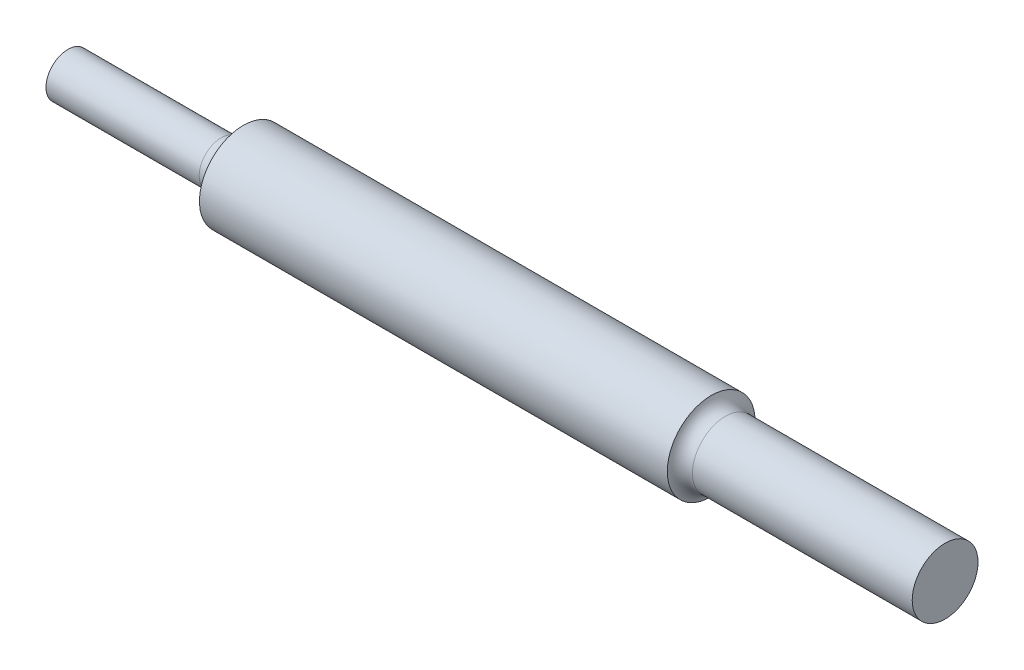
ISO-10303-21;
HEADER;
FILE_DESCRIPTION(('STEP AP214'),'2;1');
FILE_NAME('part.step','',(''),(''),'','','');
FILE_SCHEMA(('AUTOMOTIVE_DESIGN { 1 0 10303 214 1 1 1 1 }'));
ENDSEC;
DATA;
#1=APPLICATION_CONTEXT('core data for automotive mechanical design processes');
#2=APPLICATION_PROTOCOL_DEFINITION('international standard','automotive_design',2000,#1);
#3=PRODUCT_CONTEXT('',#1,'mechanical');
#4=PRODUCT('Part','Part','',(#3));
#5=PRODUCT_RELATED_PRODUCT_CATEGORY('part','',(#4));
#6=PRODUCT_DEFINITION_FORMATION('','',#4);
#7=PRODUCT_DEFINITION_CONTEXT('part definition',#1,'design');
#8=PRODUCT_DEFINITION('design','',#6,#7);
#9=PRODUCT_DEFINITION_SHAPE('','',#8);
#10=(LENGTH_UNIT() NAMED_UNIT(*) SI_UNIT(.MILLI.,.METRE.));
#11=(NAMED_UNIT(*) PLANE_ANGLE_UNIT() SI_UNIT($,.RADIAN.));
#12=(NAMED_UNIT(*) SI_UNIT($,.STERADIAN.) SOLID_ANGLE_UNIT());
#13=UNCERTAINTY_MEASURE_WITH_UNIT(LENGTH_MEASURE(1.E-05),#10,'distance_accuracy_value','');
#14=(GEOMETRIC_REPRESENTATION_CONTEXT(3) GLOBAL_UNCERTAINTY_ASSIGNED_CONTEXT((#13)) GLOBAL_UNIT_ASSIGNED_CONTEXT((#10,
#11,#12)) REPRESENTATION_CONTEXT('',''));
#15=CARTESIAN_POINT('',(0.,0.,0.));
#16=DIRECTION('',(0.,0.,1.));
#17=DIRECTION('',(1.,0.,0.));
#18=AXIS2_PLACEMENT_3D('',#15,#16,#17);
#19=CARTESIAN_POINT('',(203.2,0.,0.));
#20=DIRECTION('',(-1.,0.,0.));
#21=DIRECTION('',(0.,0.,1.));
#22=AXIS2_PLACEMENT_3D('',#19,#20,#21);
#23=CYLINDRICAL_SURFACE('',#22,19.05);
#24=CARTESIAN_POINT('',(203.2,0.,0.));
#25=DIRECTION('',(1.,0.,0.));
#26=DIRECTION('',(0.,0.,-1.));
#27=AXIS2_PLACEMENT_3D('',#24,#25,#26);
#28=CIRCLE('',#27,19.05);
#29=CARTESIAN_POINT('',(203.2,0.,-19.05));
#30=VERTEX_POINT('',#29);
#31=EDGE_CURVE('E50',#30,#30,#28,.T.);
#32=ORIENTED_EDGE('',*,*,#31,.F.);
#33=EDGE_LOOP('',(#32));
#34=FACE_BOUND('',#33,.T.);
#35=CARTESIAN_POINT('',(0.,0.,0.));
#36=DIRECTION('',(1.,0.,0.));
#37=DIRECTION('',(0.,0.,-1.));
#38=AXIS2_PLACEMENT_3D('',#35,#36,#37);
#39=CIRCLE('',#38,19.05);
#40=CARTESIAN_POINT('',(0.,0.,-19.05));
#41=VERTEX_POINT('',#40);
#42=EDGE_CURVE('E55',#41,#41,#39,.T.);
#43=ORIENTED_EDGE('',*,*,#42,.T.);
#44=EDGE_LOOP('',(#43));
#45=FACE_BOUND('',#44,.T.);
#46=ADVANCED_FACE('F37',(#34,#45),#23,.T.);
#47=CARTESIAN_POINT('',(304.8,0.,0.));
#48=DIRECTION('',(-1.,0.,0.));
#49=DIRECTION('',(0.,0.,1.));
#50=AXIS2_PLACEMENT_3D('',#47,#48,#49);
#51=CYLINDRICAL_SURFACE('',#50,14.2875);
#52=CARTESIAN_POINT('',(209.348361062104,0.,0.));
#53=DIRECTION('',(-1.,0.,0.));
#54=DIRECTION('',(0.,0.,1.));
#55=AXIS2_PLACEMENT_3D('',#52,#53,#54);
#56=CIRCLE('',#55,14.2875);
#57=CARTESIAN_POINT('',(209.348361062104,0.,14.2875));
#58=VERTEX_POINT('',#57);
#59=EDGE_CURVE('E10',#58,#58,#56,.F.);
#60=ORIENTED_EDGE('',*,*,#59,.T.);
#61=EDGE_LOOP('',(#60));
#62=FACE_BOUND('',#61,.T.);
#63=CARTESIAN_POINT('',(304.8,0.,0.));
#64=DIRECTION('',(1.,0.,0.));
#65=DIRECTION('',(0.,0.,-1.));
#66=AXIS2_PLACEMENT_3D('',#63,#64,#65);
#67=CIRCLE('',#66,14.2875);
#68=CARTESIAN_POINT('',(304.8,0.,-14.2875));
#69=VERTEX_POINT('',#68);
#70=EDGE_CURVE('E60',#69,#69,#67,.T.);
#71=ORIENTED_EDGE('',*,*,#70,.F.);
#72=EDGE_LOOP('',(#71));
#73=FACE_BOUND('',#72,.T.);
#74=ADVANCED_FACE('F82',(#62,#73),#51,.T.);
#75=CARTESIAN_POINT('',(304.8,0.,0.));
#76=DIRECTION('',(1.,0.,0.));
#77=DIRECTION('',(0.,0.,-1.));
#78=AXIS2_PLACEMENT_3D('',#75,#76,#77);
#79=PLANE('',#78);
#80=ORIENTED_EDGE('',*,*,#70,.T.);
#81=EDGE_LOOP('',(#80));
#82=FACE_BOUND('',#81,.T.);
#83=ADVANCED_FACE('F74',(#82),#79,.T.);
#84=CARTESIAN_POINT('',(-76.2,0.,0.));
#85=DIRECTION('',(1.,0.,0.));
#86=DIRECTION('',(0.,0.,-1.));
#87=AXIS2_PLACEMENT_3D('',#84,#85,#86);
#88=CYLINDRICAL_SURFACE('',#87,9.525);
#89=CARTESIAN_POINT('',(-9.65116443751739,0.,0.));
#90=DIRECTION('',(1.,0.,0.));
#91=DIRECTION('',(0.,0.,-1.));
#92=AXIS2_PLACEMENT_3D('',#89,#90,#91);
#93=CIRCLE('',#92,9.525);
#94=CARTESIAN_POINT('',(-9.6511644375174,0.,-9.525));
#95=VERTEX_POINT('',#94);
#96=EDGE_CURVE('E45',#95,#95,#93,.F.);
#97=CARTESIAN_POINT('',(-76.2,0.,0.));
#98=DIRECTION('',(-1.,0.,0.));
#99=DIRECTION('',(0.,0.,1.));
#100=AXIS2_PLACEMENT_3D('',#97,#98,#99);
#101=CIRCLE('',#100,9.525);
#102=CARTESIAN_POINT('',(-76.2,0.,-9.525));
#103=VERTEX_POINT('',#102);
#104=EDGE_CURVE('E65',#103,#103,#101,.T.);
#105=CARTESIAN_POINT('',(-9.6511644375174,0.,-9.525));
#106=CARTESIAN_POINT('',(-10.3443814746266,0.,-9.525));
#107=CARTESIAN_POINT('',(-11.0375985117358,0.,-9.525));
#108=CARTESIAN_POINT('',(-12.4240325859542,0.,-9.525));
#109=CARTESIAN_POINT('',(-13.1172496230634,0.,-9.525));
#110=CARTESIAN_POINT('',(-14.5036836972817,0.,-9.525));
#111=CARTESIAN_POINT('',(-15.1969007343909,0.,-9.525));
#112=CARTESIAN_POINT('',(-16.5833348086093,0.,-9.525));
#113=CARTESIAN_POINT('',(-17.2765518457185,0.,-9.525));
#114=CARTESIAN_POINT('',(-18.6629859199369,0.,-9.525));
#115=CARTESIAN_POINT('',(-19.3562029570461,0.,-9.525));
#116=CARTESIAN_POINT('',(-20.7426370312645,0.,-9.525));
#117=CARTESIAN_POINT('',(-21.4358540683737,0.,-9.525));
#118=CARTESIAN_POINT('',(-22.8222881425921,0.,-9.525));
#119=CARTESIAN_POINT('',(-23.5155051797013,0.,-9.525));
#120=CARTESIAN_POINT('',(-24.9019392539197,0.,-9.525));
#121=CARTESIAN_POINT('',(-25.5951562910289,0.,-9.525));
#122=CARTESIAN_POINT('',(-26.9815903652472,0.,-9.525));
#123=CARTESIAN_POINT('',(-27.6748074023564,0.,-9.525));
#124=CARTESIAN_POINT('',(-29.0612414765748,0.,-9.525));
#125=CARTESIAN_POINT('',(-29.754458513684,0.,-9.525));
#126=CARTESIAN_POINT('',(-31.1408925879024,0.,-9.525));
#127=CARTESIAN_POINT('',(-31.8341096250116,0.,-9.525));
#128=CARTESIAN_POINT('',(-33.22054369923,0.,-9.525));
#129=CARTESIAN_POINT('',(-33.9137607363392,0.,-9.525));
#130=CARTESIAN_POINT('',(-35.3001948105576,0.,-9.525));
#131=CARTESIAN_POINT('',(-35.9934118476668,0.,-9.525));
#132=CARTESIAN_POINT('',(-37.3798459218851,0.,-9.525));
#133=CARTESIAN_POINT('',(-38.0730629589943,0.,-9.525));
#134=CARTESIAN_POINT('',(-39.4594970332127,0.,-9.525));
#135=CARTESIAN_POINT('',(-40.1527140703219,0.,-9.525));
#136=CARTESIAN_POINT('',(-41.5391481445403,0.,-9.525));
#137=CARTESIAN_POINT('',(-42.2323651816495,0.,-9.525));
#138=CARTESIAN_POINT('',(-43.6187992558679,0.,-9.525));
#139=CARTESIAN_POINT('',(-44.3120162929771,0.,-9.525));
#140=CARTESIAN_POINT('',(-45.6984503671955,0.,-9.525));
#141=CARTESIAN_POINT('',(-46.3916674043047,0.,-9.525));
#142=CARTESIAN_POINT('',(-47.778101478523,0.,-9.525));
#143=CARTESIAN_POINT('',(-48.4713185156322,0.,-9.525));
#144=CARTESIAN_POINT('',(-49.8577525898506,0.,-9.525));
#145=CARTESIAN_POINT('',(-50.5509696269598,0.,-9.525));
#146=CARTESIAN_POINT('',(-51.9374037011782,0.,-9.525));
#147=CARTESIAN_POINT('',(-52.6306207382874,0.,-9.525));
#148=CARTESIAN_POINT('',(-54.0170548125058,0.,-9.525));
#149=CARTESIAN_POINT('',(-54.710271849615,0.,-9.525));
#150=CARTESIAN_POINT('',(-56.0967059238334,0.,-9.525));
#151=CARTESIAN_POINT('',(-56.7899229609426,0.,-9.525));
#152=CARTESIAN_POINT('',(-58.176357035161,0.,-9.525));
#153=CARTESIAN_POINT('',(-58.8695740722702,0.,-9.525));
#154=CARTESIAN_POINT('',(-60.2560081464885,0.,-9.525));
#155=CARTESIAN_POINT('',(-60.9492251835977,0.,-9.525));
#156=CARTESIAN_POINT('',(-62.3356592578161,0.,-9.525));
#157=CARTESIAN_POINT('',(-63.0288762949253,0.,-9.525));
#158=CARTESIAN_POINT('',(-64.4153103691437,0.,-9.525));
#159=CARTESIAN_POINT('',(-65.1085274062529,0.,-9.525));
#160=CARTESIAN_POINT('',(-66.4949614804713,0.,-9.525));
#161=CARTESIAN_POINT('',(-67.1881785175805,0.,-9.525));
#162=CARTESIAN_POINT('',(-68.5746125917989,0.,-9.525));
#163=CARTESIAN_POINT('',(-69.2678296289081,0.,-9.525));
#164=CARTESIAN_POINT('',(-70.6542637031265,0.,-9.525));
#165=CARTESIAN_POINT('',(-71.3474807402357,0.,-9.525));
#166=CARTESIAN_POINT('',(-72.733914814454,0.,-9.525));
#167=CARTESIAN_POINT('',(-73.4271318515632,0.,-9.525));
#168=CARTESIAN_POINT('',(-74.8135659257816,0.,-9.525));
#169=CARTESIAN_POINT('',(-75.5067829628908,0.,-9.525));
#170=CARTESIAN_POINT('',(-76.2,0.,-9.525));
#171=B_SPLINE_CURVE_WITH_KNOTS('',3,(#105,#106,#107,#108,#109,#110,#111,#112,#113,#114,#115,
#116,#117,#118,#119,#120,#121,#122,#123,#124,#125,#126,#127,#128,#129,#130,#131,#132,#133,#134,
#135,#136,#137,#138,#139,#140,#141,#142,#143,#144,#145,#146,#147,#148,#149,#150,#151,#152,#153,
#154,#155,#156,#157,#158,#159,#160,#161,#162,#163,#164,#165,#166,#167,#168,#169,#170),
.UNSPECIFIED.,.F.,.F.,(4,2,2,2,2,2,2,2,2,2,2,2,2,2,2,2,2,2,2,2,2,2,2,2,2,2,2,2,2,2,2,2,4),(0.,
2.07965111132759,4.15930222265516,6.23895333398274,8.31860444531032,10.3982555566379,
12.4779066679655,14.5575577792931,16.6372088906206,18.7168600019482,20.7965111132758,
22.8761622246034,24.955813335931,27.0354644472586,29.1151155585861,31.1947666699137,
33.2744177812413,35.3540688925689,37.4337200038965,39.513371115224,41.5930222265516,
43.6726733378792,45.7523244492068,47.8319755605344,49.911626671862,51.9912777831895,
54.0709288945171,56.1505800058447,58.2302311171723,60.3098822284999,62.3895333398274,
64.469184451155,66.5488355624826),.UNSPECIFIED.);
#172=EDGE_CURVE('BSEAM72',#95,#103,#171,.T.);
#173=ORIENTED_EDGE('',*,*,#96,.T.);
#174=ORIENTED_EDGE('',*,*,#104,.F.);
#175=ORIENTED_EDGE('',*,*,#172,.T.);
#176=ORIENTED_EDGE('',*,*,#172,.F.);
#177=EDGE_LOOP('',(#173,#175,#174,#176));
#178=FACE_BOUND('',#177,.T.);
#179=ADVANCED_FACE('F72',(#178),#88,.T.);
#180=CARTESIAN_POINT('',(-76.2,0.,0.));
#181=DIRECTION('',(-1.,0.,0.));
#182=DIRECTION('',(0.,0.,1.));
#183=AXIS2_PLACEMENT_3D('',#180,#181,#182);
#184=PLANE('',#183);
#185=ORIENTED_EDGE('',*,*,#104,.T.);
#186=EDGE_LOOP('',(#185));
#187=FACE_BOUND('',#186,.T.);
#188=ADVANCED_FACE('F70',(#187),#184,.T.);
#189=CARTESIAN_POINT('',(-9.65116443751737,0.,0.));
#190=DIRECTION('',(1.,0.,0.));
#191=DIRECTION('',(0.,0.,-1.));
#192=AXIS2_PLACEMENT_3D('',#189,#190,#191);
#193=TOROIDAL_SURFACE('',#192,19.177,9.652);
#194=ORIENTED_EDGE('',*,*,#42,.F.);
#195=EDGE_LOOP('',(#194));
#196=FACE_BOUND('',#195,.T.);
#197=ORIENTED_EDGE('',*,*,#96,.F.);
#198=EDGE_LOOP('',(#197));
#199=FACE_BOUND('',#198,.T.);
#200=ADVANCED_FACE('F80',(#196,#199),#193,.F.);
#201=CARTESIAN_POINT('',(209.348361062104,0.,0.));
#202=DIRECTION('',(-1.,0.,0.));
#203=DIRECTION('',(0.,0.,1.));
#204=AXIS2_PLACEMENT_3D('',#201,#202,#203);
#205=TOROIDAL_SURFACE('',#204,20.6375,6.35);
#206=ORIENTED_EDGE('',*,*,#31,.T.);
#207=EDGE_LOOP('',(#206));
#208=FACE_BOUND('',#207,.T.);
#209=ORIENTED_EDGE('',*,*,#59,.F.);
#210=EDGE_LOOP('',(#209));
#211=FACE_BOUND('',#210,.T.);
#212=ADVANCED_FACE('F39',(#208,#211),#205,.F.);
#213=CLOSED_SHELL('',(#46,#74,#83,#179,#188,#200,#212));
#214=MANIFOLD_SOLID_BREP('B2',#213);
#215=ADVANCED_BREP_SHAPE_REPRESENTATION('',(#18,#214),#14);
#216=SHAPE_DEFINITION_REPRESENTATION(#9,#215);
ENDSEC;
END-ISO-10303-21;
